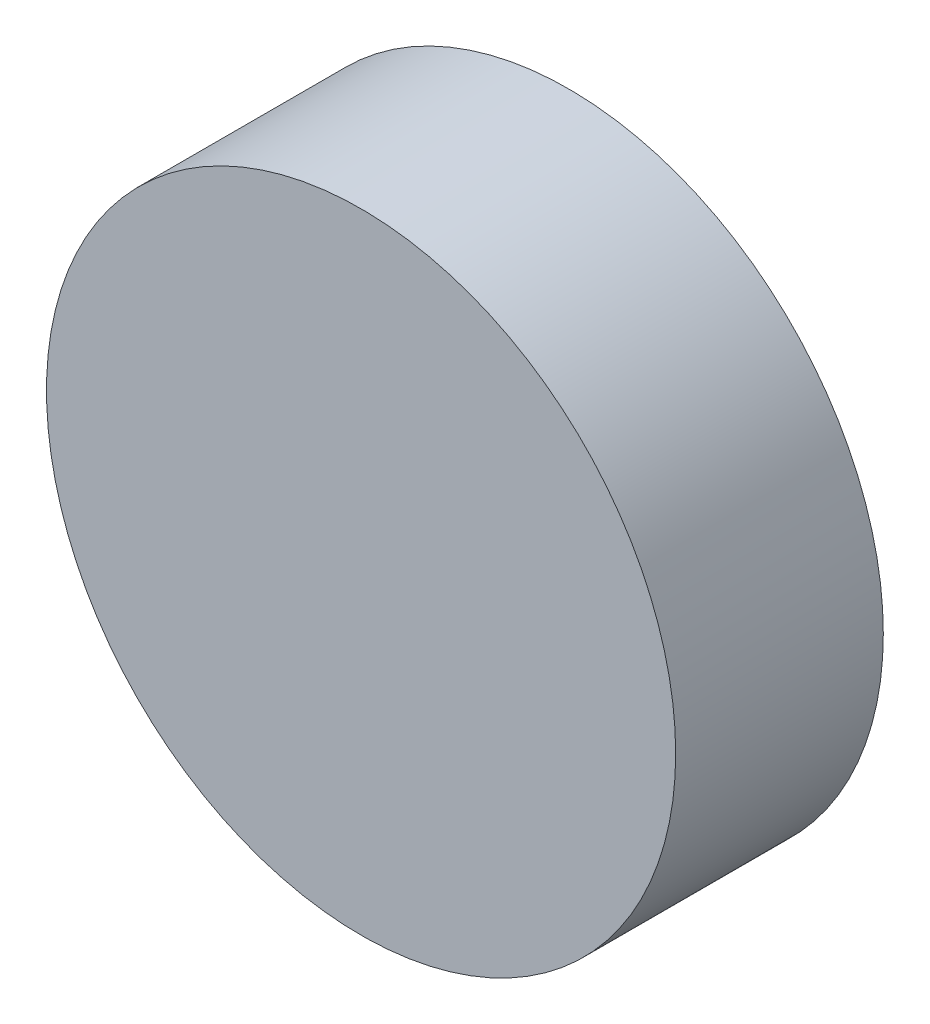
ISO-10303-21;
HEADER;
FILE_DESCRIPTION(('STEP AP214'),'2;1');
FILE_NAME('part.step','',(''),(''),'','','');
FILE_SCHEMA(('AUTOMOTIVE_DESIGN { 1 0 10303 214 1 1 1 1 }'));
ENDSEC;
DATA;
#1=APPLICATION_CONTEXT('core data for automotive mechanical design processes');
#2=APPLICATION_PROTOCOL_DEFINITION('international standard','automotive_design',2000,#1);
#3=PRODUCT_CONTEXT('',#1,'mechanical');
#4=PRODUCT('Part','Part','',(#3));
#5=PRODUCT_RELATED_PRODUCT_CATEGORY('part','',(#4));
#6=PRODUCT_DEFINITION_FORMATION('','',#4);
#7=PRODUCT_DEFINITION_CONTEXT('part definition',#1,'design');
#8=PRODUCT_DEFINITION('design','',#6,#7);
#9=PRODUCT_DEFINITION_SHAPE('','',#8);
#10=(LENGTH_UNIT() NAMED_UNIT(*) SI_UNIT(.MILLI.,.METRE.));
#11=(NAMED_UNIT(*) PLANE_ANGLE_UNIT() SI_UNIT($,.RADIAN.));
#12=(NAMED_UNIT(*) SI_UNIT($,.STERADIAN.) SOLID_ANGLE_UNIT());
#13=UNCERTAINTY_MEASURE_WITH_UNIT(LENGTH_MEASURE(1.E-05),#10,'distance_accuracy_value','');
#14=(GEOMETRIC_REPRESENTATION_CONTEXT(3) GLOBAL_UNCERTAINTY_ASSIGNED_CONTEXT((#13)) GLOBAL_UNIT_ASSIGNED_CONTEXT((#10,
#11,#12)) REPRESENTATION_CONTEXT('',''));
#15=CARTESIAN_POINT('',(0.,0.,0.));
#16=DIRECTION('',(0.,0.,1.));
#17=DIRECTION('',(1.,0.,0.));
#18=AXIS2_PLACEMENT_3D('',#15,#16,#17);
#19=CARTESIAN_POINT('',(0.,0.,1.65));
#20=DIRECTION('',(0.,0.,-1.));
#21=DIRECTION('',(-1.,0.,0.));
#22=AXIS2_PLACEMENT_3D('',#19,#20,#21);
#23=CYLINDRICAL_SURFACE('',#22,5.);
#24=CARTESIAN_POINT('',(0.,0.,1.65));
#25=DIRECTION('',(0.,0.,1.));
#26=DIRECTION('',(1.,0.,0.));
#27=AXIS2_PLACEMENT_3D('',#24,#25,#26);
#28=CIRCLE('',#27,5.);
#29=CARTESIAN_POINT('',(5.,0.,1.65));
#30=VERTEX_POINT('',#29);
#31=EDGE_CURVE('E10',#30,#30,#28,.T.);
#32=ORIENTED_EDGE('',*,*,#31,.F.);
#33=EDGE_LOOP('',(#32));
#34=FACE_BOUND('',#33,.T.);
#35=CARTESIAN_POINT('',(0.,0.,-1.65));
#36=DIRECTION('',(0.,0.,1.));
#37=DIRECTION('',(1.,0.,0.));
#38=AXIS2_PLACEMENT_3D('',#35,#36,#37);
#39=CIRCLE('',#38,5.);
#40=CARTESIAN_POINT('',(5.,0.,-1.65));
#41=VERTEX_POINT('',#40);
#42=EDGE_CURVE('E37',#41,#41,#39,.T.);
#43=ORIENTED_EDGE('',*,*,#42,.T.);
#44=EDGE_LOOP('',(#43));
#45=FACE_BOUND('',#44,.T.);
#46=ADVANCED_FACE('F40',(#34,#45),#23,.T.);
#47=CARTESIAN_POINT('',(0.,0.,1.65));
#48=DIRECTION('',(0.,0.,1.));
#49=DIRECTION('',(1.,0.,0.));
#50=AXIS2_PLACEMENT_3D('',#47,#48,#49);
#51=PLANE('',#50);
#52=ORIENTED_EDGE('',*,*,#31,.T.);
#53=EDGE_LOOP('',(#52));
#54=FACE_BOUND('',#53,.T.);
#55=ADVANCED_FACE('F55',(#54),#51,.T.);
#56=CARTESIAN_POINT('',(0.,0.,-1.65));
#57=DIRECTION('',(0.,0.,1.));
#58=DIRECTION('',(1.,0.,0.));
#59=AXIS2_PLACEMENT_3D('',#56,#57,#58);
#60=PLANE('',#59);
#61=ORIENTED_EDGE('',*,*,#42,.F.);
#62=EDGE_LOOP('',(#61));
#63=FACE_BOUND('',#62,.T.);
#64=ADVANCED_FACE('F49',(#63),#60,.F.);
#65=CLOSED_SHELL('',(#46,#55,#64));
#66=MANIFOLD_SOLID_BREP('B2',#65);
#67=ADVANCED_BREP_SHAPE_REPRESENTATION('',(#18,#66),#14);
#68=SHAPE_DEFINITION_REPRESENTATION(#9,#67);
ENDSEC;
END-ISO-10303-21;
